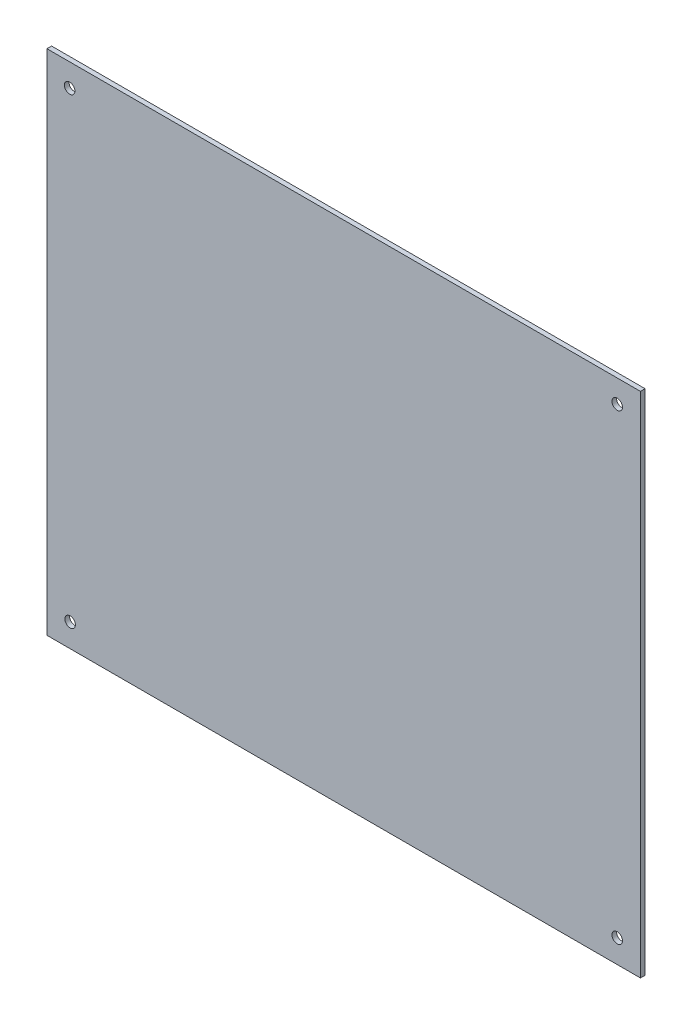
ISO-10303-21;
HEADER;
FILE_DESCRIPTION(('STEP AP214'),'2;1');
FILE_NAME('part.step','',(''),(''),'','','');
FILE_SCHEMA(('AUTOMOTIVE_DESIGN { 1 0 10303 214 1 1 1 1 }'));
ENDSEC;
DATA;
#1=APPLICATION_CONTEXT('core data for automotive mechanical design processes');
#2=APPLICATION_PROTOCOL_DEFINITION('international standard','automotive_design',2000,#1);
#3=PRODUCT_CONTEXT('',#1,'mechanical');
#4=PRODUCT('Part','Part','',(#3));
#5=PRODUCT_RELATED_PRODUCT_CATEGORY('part','',(#4));
#6=PRODUCT_DEFINITION_FORMATION('','',#4);
#7=PRODUCT_DEFINITION_CONTEXT('part definition',#1,'design');
#8=PRODUCT_DEFINITION('design','',#6,#7);
#9=PRODUCT_DEFINITION_SHAPE('','',#8);
#10=(LENGTH_UNIT() NAMED_UNIT(*) SI_UNIT(.MILLI.,.METRE.));
#11=(NAMED_UNIT(*) PLANE_ANGLE_UNIT() SI_UNIT($,.RADIAN.));
#12=(NAMED_UNIT(*) SI_UNIT($,.STERADIAN.) SOLID_ANGLE_UNIT());
#13=UNCERTAINTY_MEASURE_WITH_UNIT(LENGTH_MEASURE(1.E-05),#10,'distance_accuracy_value','');
#14=(GEOMETRIC_REPRESENTATION_CONTEXT(3) GLOBAL_UNCERTAINTY_ASSIGNED_CONTEXT((#13)) GLOBAL_UNIT_ASSIGNED_CONTEXT((#10,
#11,#12)) REPRESENTATION_CONTEXT('',''));
#15=CARTESIAN_POINT('',(0.,0.,0.));
#16=DIRECTION('',(0.,0.,1.));
#17=DIRECTION('',(1.,0.,0.));
#18=AXIS2_PLACEMENT_3D('',#15,#16,#17);
#19=CARTESIAN_POINT('',(0.,0.,1.905));
#20=DIRECTION('',(0.,0.,-1.));
#21=DIRECTION('',(-1.,0.,0.));
#22=AXIS2_PLACEMENT_3D('',#19,#20,#21);
#23=PLANE('',#22);
#24=CARTESIAN_POINT('',(9.32499900000117,198.955000999999,1.905));
#25=DIRECTION('',(0.,0.,1.));
#26=DIRECTION('',(1.,0.,0.));
#27=AXIS2_PLACEMENT_3D('',#24,#25,#26);
#28=CIRCLE('',#27,2.15264999999999);
#29=CARTESIAN_POINT('',(11.4776490000012,198.955000999999,1.905));
#30=VERTEX_POINT('',#29);
#31=EDGE_CURVE('E141',#30,#30,#28,.T.);
#32=ORIENTED_EDGE('',*,*,#31,.F.);
#33=EDGE_LOOP('',(#32));
#34=FACE_BOUND('',#33,.T.);
#35=DIRECTION('',(0.,-1.,0.));
#36=VECTOR('',#35,1.);
#37=CARTESIAN_POINT('',(0.,0.,1.905));
#38=LINE('',#37,#36);
#39=CARTESIAN_POINT('',(0.,208.28,1.905));
#40=VERTEX_POINT('',#39);
#41=CARTESIAN_POINT('',(0.,0.,1.905));
#42=VERTEX_POINT('',#41);
#43=EDGE_CURVE('E95',#40,#42,#38,.T.);
#44=ORIENTED_EDGE('',*,*,#43,.T.);
#45=DIRECTION('',(1.,0.,0.));
#46=VECTOR('',#45,1.);
#47=CARTESIAN_POINT('',(0.,0.,1.905));
#48=LINE('',#47,#46);
#49=CARTESIAN_POINT('',(243.332,0.,1.905));
#50=VERTEX_POINT('',#49);
#51=EDGE_CURVE('E90',#42,#50,#48,.T.);
#52=ORIENTED_EDGE('',*,*,#51,.T.);
#53=DIRECTION('',(0.,1.,0.));
#54=VECTOR('',#53,1.);
#55=CARTESIAN_POINT('',(243.332,0.,1.905));
#56=LINE('',#55,#54);
#57=CARTESIAN_POINT('',(243.332,208.28,1.905));
#58=VERTEX_POINT('',#57);
#59=EDGE_CURVE('E93',#50,#58,#56,.T.);
#60=ORIENTED_EDGE('',*,*,#59,.T.);
#61=DIRECTION('',(-1.,0.,0.));
#62=VECTOR('',#61,1.);
#63=CARTESIAN_POINT('',(0.,208.28,1.905));
#64=LINE('',#63,#62);
#65=EDGE_CURVE('E60',#58,#40,#64,.T.);
#66=ORIENTED_EDGE('',*,*,#65,.T.);
#67=EDGE_LOOP('',(#44,#52,#60,#66));
#68=FACE_BOUND('',#67,.T.);
#69=CARTESIAN_POINT('',(233.807,198.955000999999,1.905));
#70=DIRECTION('',(0.,0.,1.));
#71=DIRECTION('',(1.,0.,0.));
#72=AXIS2_PLACEMENT_3D('',#69,#70,#71);
#73=CIRCLE('',#72,2.15264999999998);
#74=CARTESIAN_POINT('',(235.95965,198.955000999999,1.905));
#75=VERTEX_POINT('',#74);
#76=EDGE_CURVE('E123',#75,#75,#73,.T.);
#77=ORIENTED_EDGE('',*,*,#76,.F.);
#78=EDGE_LOOP('',(#77));
#79=FACE_BOUND('',#78,.T.);
#80=CARTESIAN_POINT('',(9.525,9.525,1.905));
#81=DIRECTION('',(0.,0.,1.));
#82=DIRECTION('',(1.,0.,0.));
#83=AXIS2_PLACEMENT_3D('',#80,#81,#82);
#84=CIRCLE('',#83,2.15264999999999);
#85=CARTESIAN_POINT('',(11.67765,9.525,1.905));
#86=VERTEX_POINT('',#85);
#87=EDGE_CURVE('E129',#86,#86,#84,.T.);
#88=ORIENTED_EDGE('',*,*,#87,.F.);
#89=EDGE_LOOP('',(#88));
#90=FACE_BOUND('',#89,.T.);
#91=CARTESIAN_POINT('',(233.807,9.525,1.905));
#92=DIRECTION('',(0.,0.,1.));
#93=DIRECTION('',(1.,0.,0.));
#94=AXIS2_PLACEMENT_3D('',#91,#92,#93);
#95=CIRCLE('',#94,2.15264999999998);
#96=CARTESIAN_POINT('',(235.95965,9.525,1.905));
#97=VERTEX_POINT('',#96);
#98=EDGE_CURVE('E135',#97,#97,#95,.T.);
#99=ORIENTED_EDGE('',*,*,#98,.F.);
#100=EDGE_LOOP('',(#99));
#101=FACE_BOUND('',#100,.T.);
#102=ADVANCED_FACE('F43',(#34,#68,#79,#90,#101),#23,.F.);
#103=CARTESIAN_POINT('',(0.,0.,1.905));
#104=DIRECTION('',(1.,0.,0.));
#105=DIRECTION('',(0.,0.,-1.));
#106=AXIS2_PLACEMENT_3D('',#103,#104,#105);
#107=PLANE('',#106);
#108=DIRECTION('',(0.,-1.,0.));
#109=VECTOR('',#108,1.);
#110=CARTESIAN_POINT('',(0.,0.,0.));
#111=LINE('',#110,#109);
#112=CARTESIAN_POINT('',(0.,208.28,0.));
#113=VERTEX_POINT('',#112);
#114=CARTESIAN_POINT('',(0.,0.,0.));
#115=VERTEX_POINT('',#114);
#116=EDGE_CURVE('E107',#113,#115,#111,.T.);
#117=ORIENTED_EDGE('',*,*,#116,.T.);
#118=DIRECTION('',(0.,0.,-1.));
#119=VECTOR('',#118,1.);
#120=CARTESIAN_POINT('',(0.,0.,1.905));
#121=LINE('',#120,#119);
#122=EDGE_CURVE('E11',#42,#115,#121,.T.);
#123=ORIENTED_EDGE('',*,*,#122,.F.);
#124=ORIENTED_EDGE('',*,*,#43,.F.);
#125=DIRECTION('',(0.,0.,-1.));
#126=VECTOR('',#125,1.);
#127=CARTESIAN_POINT('',(0.,208.28,1.905));
#128=LINE('',#127,#126);
#129=EDGE_CURVE('E103',#40,#113,#128,.T.);
#130=ORIENTED_EDGE('',*,*,#129,.T.);
#131=EDGE_LOOP('',(#117,#123,#124,#130));
#132=FACE_BOUND('',#131,.T.);
#133=ADVANCED_FACE('F45',(#132),#107,.F.);
#134=CARTESIAN_POINT('',(0.,0.,1.905));
#135=DIRECTION('',(0.,1.,0.));
#136=DIRECTION('',(0.,0.,1.));
#137=AXIS2_PLACEMENT_3D('',#134,#135,#136);
#138=PLANE('',#137);
#139=DIRECTION('',(1.,0.,0.));
#140=VECTOR('',#139,1.);
#141=CARTESIAN_POINT('',(0.,0.,0.));
#142=LINE('',#141,#140);
#143=CARTESIAN_POINT('',(243.332,0.,0.));
#144=VERTEX_POINT('',#143);
#145=EDGE_CURVE('E99',#115,#144,#142,.T.);
#146=ORIENTED_EDGE('',*,*,#145,.T.);
#147=DIRECTION('',(0.,0.,-1.));
#148=VECTOR('',#147,1.);
#149=CARTESIAN_POINT('',(243.332,0.,1.905));
#150=LINE('',#149,#148);
#151=EDGE_CURVE('E52',#50,#144,#150,.T.);
#152=ORIENTED_EDGE('',*,*,#151,.F.);
#153=ORIENTED_EDGE('',*,*,#51,.F.);
#154=ORIENTED_EDGE('',*,*,#122,.T.);
#155=EDGE_LOOP('',(#146,#152,#153,#154));
#156=FACE_BOUND('',#155,.T.);
#157=ADVANCED_FACE('F98',(#156),#138,.F.);
#158=CARTESIAN_POINT('',(243.332,0.,1.905));
#159=DIRECTION('',(-1.,0.,0.));
#160=DIRECTION('',(0.,0.,1.));
#161=AXIS2_PLACEMENT_3D('',#158,#159,#160);
#162=PLANE('',#161);
#163=DIRECTION('',(0.,1.,0.));
#164=VECTOR('',#163,1.);
#165=CARTESIAN_POINT('',(243.332,0.,0.));
#166=LINE('',#165,#164);
#167=CARTESIAN_POINT('',(243.332,208.28,0.));
#168=VERTEX_POINT('',#167);
#169=EDGE_CURVE('E77',#144,#168,#166,.T.);
#170=ORIENTED_EDGE('',*,*,#169,.T.);
#171=DIRECTION('',(0.,0.,-1.));
#172=VECTOR('',#171,1.);
#173=CARTESIAN_POINT('',(243.332,208.28,1.905));
#174=LINE('',#173,#172);
#175=EDGE_CURVE('E100',#58,#168,#174,.T.);
#176=ORIENTED_EDGE('',*,*,#175,.F.);
#177=ORIENTED_EDGE('',*,*,#59,.F.);
#178=ORIENTED_EDGE('',*,*,#151,.T.);
#179=EDGE_LOOP('',(#170,#176,#177,#178));
#180=FACE_BOUND('',#179,.T.);
#181=ADVANCED_FACE('F101',(#180),#162,.F.);
#182=CARTESIAN_POINT('',(0.,208.28,1.905));
#183=DIRECTION('',(0.,-1.,0.));
#184=DIRECTION('',(0.,0.,-1.));
#185=AXIS2_PLACEMENT_3D('',#182,#183,#184);
#186=PLANE('',#185);
#187=DIRECTION('',(-1.,0.,0.));
#188=VECTOR('',#187,1.);
#189=CARTESIAN_POINT('',(0.,208.28,0.));
#190=LINE('',#189,#188);
#191=EDGE_CURVE('E83',#168,#113,#190,.T.);
#192=ORIENTED_EDGE('',*,*,#191,.T.);
#193=ORIENTED_EDGE('',*,*,#129,.F.);
#194=ORIENTED_EDGE('',*,*,#65,.F.);
#195=ORIENTED_EDGE('',*,*,#175,.T.);
#196=EDGE_LOOP('',(#192,#193,#194,#195));
#197=FACE_BOUND('',#196,.T.);
#198=ADVANCED_FACE('F115',(#197),#186,.F.);
#199=CARTESIAN_POINT('',(0.,0.,0.));
#200=DIRECTION('',(0.,0.,-1.));
#201=DIRECTION('',(-1.,0.,0.));
#202=AXIS2_PLACEMENT_3D('',#199,#200,#201);
#203=PLANE('',#202);
#204=CARTESIAN_POINT('',(9.32499900000117,198.955000999999,0.));
#205=DIRECTION('',(0.,0.,-1.));
#206=DIRECTION('',(-1.,0.,0.));
#207=AXIS2_PLACEMENT_3D('',#204,#205,#206);
#208=CIRCLE('',#207,2.15264999999999);
#209=CARTESIAN_POINT('',(7.17234900000117,198.955000999999,0.));
#210=VERTEX_POINT('',#209);
#211=EDGE_CURVE('E138',#210,#210,#208,.T.);
#212=ORIENTED_EDGE('',*,*,#211,.F.);
#213=EDGE_LOOP('',(#212));
#214=FACE_BOUND('',#213,.T.);
#215=CARTESIAN_POINT('',(233.807,9.525,0.));
#216=DIRECTION('',(0.,0.,-1.));
#217=DIRECTION('',(-1.,0.,0.));
#218=AXIS2_PLACEMENT_3D('',#215,#216,#217);
#219=CIRCLE('',#218,2.15264999999999);
#220=CARTESIAN_POINT('',(231.65435,9.525,0.));
#221=VERTEX_POINT('',#220);
#222=EDGE_CURVE('E132',#221,#221,#219,.T.);
#223=ORIENTED_EDGE('',*,*,#222,.F.);
#224=EDGE_LOOP('',(#223));
#225=FACE_BOUND('',#224,.T.);
#226=CARTESIAN_POINT('',(9.525,9.525,0.));
#227=DIRECTION('',(0.,0.,-1.));
#228=DIRECTION('',(-1.,0.,0.));
#229=AXIS2_PLACEMENT_3D('',#226,#227,#228);
#230=CIRCLE('',#229,2.15264999999999);
#231=CARTESIAN_POINT('',(7.37235000000001,9.525,0.));
#232=VERTEX_POINT('',#231);
#233=EDGE_CURVE('E126',#232,#232,#230,.T.);
#234=ORIENTED_EDGE('',*,*,#233,.F.);
#235=EDGE_LOOP('',(#234));
#236=FACE_BOUND('',#235,.T.);
#237=CARTESIAN_POINT('',(233.807,198.955000999999,0.));
#238=DIRECTION('',(0.,0.,-1.));
#239=DIRECTION('',(-1.,0.,0.));
#240=AXIS2_PLACEMENT_3D('',#237,#238,#239);
#241=CIRCLE('',#240,2.15264999999999);
#242=CARTESIAN_POINT('',(231.65435,198.955000999999,0.));
#243=VERTEX_POINT('',#242);
#244=EDGE_CURVE('E110',#243,#243,#241,.T.);
#245=ORIENTED_EDGE('',*,*,#244,.F.);
#246=EDGE_LOOP('',(#245));
#247=FACE_BOUND('',#246,.T.);
#248=ORIENTED_EDGE('',*,*,#116,.F.);
#249=ORIENTED_EDGE('',*,*,#191,.F.);
#250=ORIENTED_EDGE('',*,*,#169,.F.);
#251=ORIENTED_EDGE('',*,*,#145,.F.);
#252=EDGE_LOOP('',(#248,#249,#250,#251));
#253=FACE_BOUND('',#252,.T.);
#254=ADVANCED_FACE('F118',(#214,#225,#236,#247,#253),#203,.T.);
#255=CARTESIAN_POINT('',(233.807,198.955000999999,1.905));
#256=DIRECTION('',(0.,0.,1.));
#257=DIRECTION('',(1.,0.,0.));
#258=AXIS2_PLACEMENT_3D('',#255,#256,#257);
#259=CYLINDRICAL_SURFACE('',#258,2.15264999999999);
#260=ORIENTED_EDGE('',*,*,#76,.T.);
#261=EDGE_LOOP('',(#260));
#262=FACE_BOUND('',#261,.T.);
#263=ORIENTED_EDGE('',*,*,#244,.T.);
#264=EDGE_LOOP('',(#263));
#265=FACE_BOUND('',#264,.T.);
#266=ADVANCED_FACE('F157',(#262,#265),#259,.F.);
#267=CARTESIAN_POINT('',(9.525,9.525,1.905));
#268=DIRECTION('',(0.,0.,1.));
#269=DIRECTION('',(1.,0.,0.));
#270=AXIS2_PLACEMENT_3D('',#267,#268,#269);
#271=CYLINDRICAL_SURFACE('',#270,2.15264999999999);
#272=ORIENTED_EDGE('',*,*,#87,.T.);
#273=EDGE_LOOP('',(#272));
#274=FACE_BOUND('',#273,.T.);
#275=ORIENTED_EDGE('',*,*,#233,.T.);
#276=EDGE_LOOP('',(#275));
#277=FACE_BOUND('',#276,.T.);
#278=ADVANCED_FACE('F198',(#274,#277),#271,.F.);
#279=CARTESIAN_POINT('',(233.807,9.525,1.905));
#280=DIRECTION('',(0.,0.,1.));
#281=DIRECTION('',(1.,0.,0.));
#282=AXIS2_PLACEMENT_3D('',#279,#280,#281);
#283=CYLINDRICAL_SURFACE('',#282,2.15264999999999);
#284=ORIENTED_EDGE('',*,*,#98,.T.);
#285=EDGE_LOOP('',(#284));
#286=FACE_BOUND('',#285,.T.);
#287=ORIENTED_EDGE('',*,*,#222,.T.);
#288=EDGE_LOOP('',(#287));
#289=FACE_BOUND('',#288,.T.);
#290=ADVANCED_FACE('F207',(#286,#289),#283,.F.);
#291=CARTESIAN_POINT('',(9.32499900000117,198.955000999999,1.905));
#292=DIRECTION('',(0.,0.,1.));
#293=DIRECTION('',(1.,0.,0.));
#294=AXIS2_PLACEMENT_3D('',#291,#292,#293);
#295=CYLINDRICAL_SURFACE('',#294,2.15264999999999);
#296=ORIENTED_EDGE('',*,*,#31,.T.);
#297=EDGE_LOOP('',(#296));
#298=FACE_BOUND('',#297,.T.);
#299=ORIENTED_EDGE('',*,*,#211,.T.);
#300=EDGE_LOOP('',(#299));
#301=FACE_BOUND('',#300,.T.);
#302=ADVANCED_FACE('F145',(#298,#301),#295,.F.);
#303=CLOSED_SHELL('',(#102,#133,#157,#181,#198,#254,#266,#278,#290,#302));
#304=MANIFOLD_SOLID_BREP('B2',#303);
#305=ADVANCED_BREP_SHAPE_REPRESENTATION('',(#18,#304),#14);
#306=SHAPE_DEFINITION_REPRESENTATION(#9,#305);
ENDSEC;
END-ISO-10303-21;
